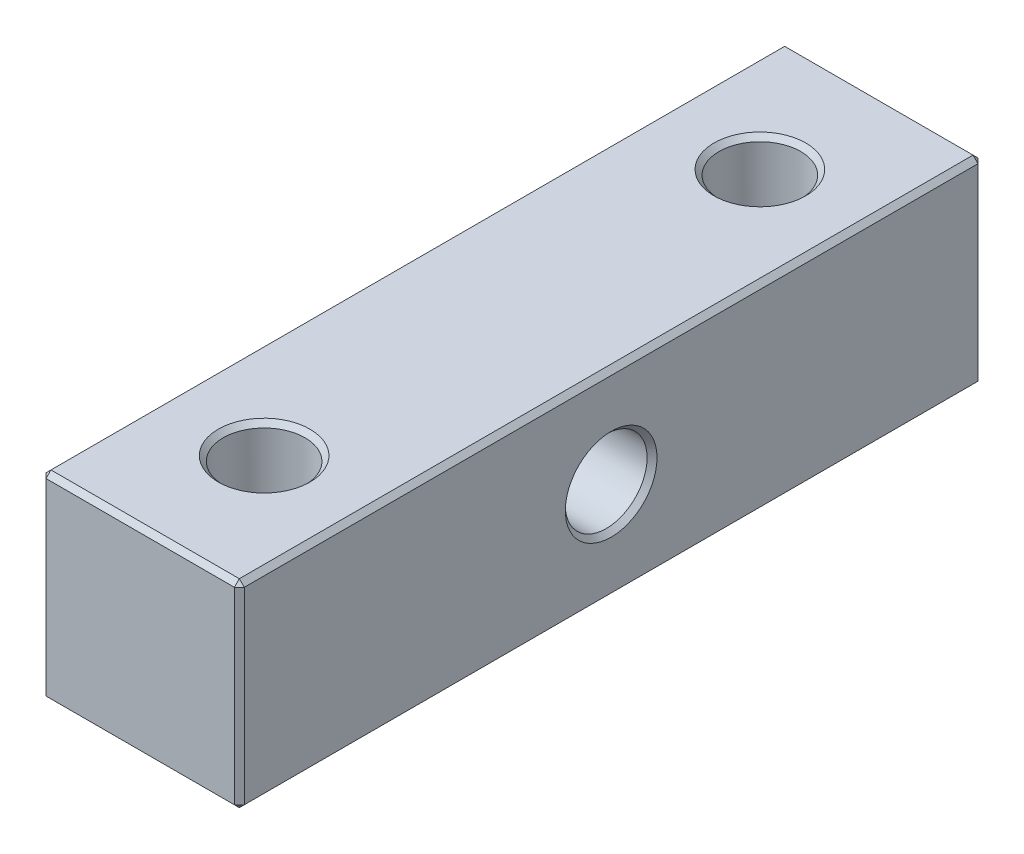
ISO-10303-21;
HEADER;
FILE_DESCRIPTION(('STEP AP214'),'2;1');
FILE_NAME('part.step','',(''),(''),'','','');
FILE_SCHEMA(('AUTOMOTIVE_DESIGN { 1 0 10303 214 1 1 1 1 }'));
ENDSEC;
DATA;
#1=APPLICATION_CONTEXT('core data for automotive mechanical design processes');
#2=APPLICATION_PROTOCOL_DEFINITION('international standard','automotive_design',2000,#1);
#3=PRODUCT_CONTEXT('',#1,'mechanical');
#4=PRODUCT('Part','Part','',(#3));
#5=PRODUCT_RELATED_PRODUCT_CATEGORY('part','',(#4));
#6=PRODUCT_DEFINITION_FORMATION('','',#4);
#7=PRODUCT_DEFINITION_CONTEXT('part definition',#1,'design');
#8=PRODUCT_DEFINITION('design','',#6,#7);
#9=PRODUCT_DEFINITION_SHAPE('','',#8);
#10=(LENGTH_UNIT() NAMED_UNIT(*) SI_UNIT(.MILLI.,.METRE.));
#11=(NAMED_UNIT(*) PLANE_ANGLE_UNIT() SI_UNIT($,.RADIAN.));
#12=(NAMED_UNIT(*) SI_UNIT($,.STERADIAN.) SOLID_ANGLE_UNIT());
#13=UNCERTAINTY_MEASURE_WITH_UNIT(LENGTH_MEASURE(1.E-05),#10,'distance_accuracy_value','');
#14=(GEOMETRIC_REPRESENTATION_CONTEXT(3) GLOBAL_UNCERTAINTY_ASSIGNED_CONTEXT((#13)) GLOBAL_UNIT_ASSIGNED_CONTEXT((#10,
#11,#12)) REPRESENTATION_CONTEXT('',''));
#15=CARTESIAN_POINT('',(0.,0.,0.));
#16=DIRECTION('',(0.,0.,1.));
#17=DIRECTION('',(1.,0.,0.));
#18=AXIS2_PLACEMENT_3D('',#15,#16,#17);
#19=CARTESIAN_POINT('',(4.,4.,15.));
#20=DIRECTION('',(-1.,0.,0.));
#21=DIRECTION('',(0.,-1.,0.));
#22=AXIS2_PLACEMENT_3D('',#19,#20,#21);
#23=PLANE('',#22);
#24=DIRECTION('',(0.,-1.,0.));
#25=VECTOR('',#24,1.);
#26=CARTESIAN_POINT('',(4.,-4.,14.8));
#27=LINE('',#26,#25);
#28=CARTESIAN_POINT('',(4.,3.8,14.8));
#29=VERTEX_POINT('',#28);
#30=CARTESIAN_POINT('',(4.,-3.8,14.8));
#31=VERTEX_POINT('',#30);
#32=EDGE_CURVE('E51',#29,#31,#27,.T.);
#33=ORIENTED_EDGE('',*,*,#32,.T.);
#34=DIRECTION('',(0.,0.,-1.));
#35=VECTOR('',#34,1.);
#36=CARTESIAN_POINT('',(4.,-3.8,15.));
#37=LINE('',#36,#35);
#38=CARTESIAN_POINT('',(4.,-3.8,-14.8));
#39=VERTEX_POINT('',#38);
#40=EDGE_CURVE('E11',#31,#39,#37,.T.);
#41=ORIENTED_EDGE('',*,*,#40,.T.);
#42=DIRECTION('',(0.,1.,0.));
#43=VECTOR('',#42,1.);
#44=CARTESIAN_POINT('',(4.,4.,-14.8));
#45=LINE('',#44,#43);
#46=CARTESIAN_POINT('',(4.,3.8,-14.8));
#47=VERTEX_POINT('',#46);
#48=EDGE_CURVE('E244',#39,#47,#45,.T.);
#49=ORIENTED_EDGE('',*,*,#48,.T.);
#50=DIRECTION('',(0.,0.,1.));
#51=VECTOR('',#50,1.);
#52=CARTESIAN_POINT('',(4.,3.8,15.));
#53=LINE('',#52,#51);
#54=EDGE_CURVE('E62',#47,#29,#53,.T.);
#55=ORIENTED_EDGE('',*,*,#54,.T.);
#56=EDGE_LOOP('',(#33,#41,#49,#55));
#57=FACE_BOUND('',#56,.T.);
#58=CARTESIAN_POINT('',(4.,0.,0.));
#59=DIRECTION('',(-1.,0.,0.));
#60=DIRECTION('',(0.,-1.,0.));
#61=AXIS2_PLACEMENT_3D('',#58,#59,#60);
#62=CIRCLE('',#61,1.84999999999999);
#63=CARTESIAN_POINT('',(4.,-1.84999999999999,0.));
#64=VERTEX_POINT('',#63);
#65=EDGE_CURVE('E241',#64,#64,#62,.T.);
#66=ORIENTED_EDGE('',*,*,#65,.T.);
#67=EDGE_LOOP('',(#66));
#68=FACE_BOUND('',#67,.T.);
#69=ADVANCED_FACE('F41',(#57,#68),#23,.F.);
#70=CARTESIAN_POINT('',(-4.,4.,15.));
#71=DIRECTION('',(0.,-1.,0.));
#72=DIRECTION('',(0.,0.,-1.));
#73=AXIS2_PLACEMENT_3D('',#70,#71,#72);
#74=PLANE('',#73);
#75=CARTESIAN_POINT('',(0.,4.,-10.));
#76=DIRECTION('',(0.,-1.,0.));
#77=DIRECTION('',(0.,0.,-1.));
#78=AXIS2_PLACEMENT_3D('',#75,#76,#77);
#79=CIRCLE('',#78,1.84999999999999);
#80=CARTESIAN_POINT('',(0.,4.,-11.85));
#81=VERTEX_POINT('',#80);
#82=EDGE_CURVE('E222',#81,#81,#79,.T.);
#83=ORIENTED_EDGE('',*,*,#82,.T.);
#84=EDGE_LOOP('',(#83));
#85=FACE_BOUND('',#84,.T.);
#86=CARTESIAN_POINT('',(0.,4.,10.));
#87=DIRECTION('',(0.,-1.,0.));
#88=DIRECTION('',(0.,0.,-1.));
#89=AXIS2_PLACEMENT_3D('',#86,#87,#88);
#90=CIRCLE('',#89,1.84999999999999);
#91=CARTESIAN_POINT('',(0.,4.,8.15000000000001));
#92=VERTEX_POINT('',#91);
#93=EDGE_CURVE('E219',#92,#92,#90,.T.);
#94=ORIENTED_EDGE('',*,*,#93,.T.);
#95=EDGE_LOOP('',(#94));
#96=FACE_BOUND('',#95,.T.);
#97=DIRECTION('',(0.,0.,1.));
#98=VECTOR('',#97,1.);
#99=CARTESIAN_POINT('',(-3.8,4.,15.));
#100=LINE('',#99,#98);
#101=CARTESIAN_POINT('',(-3.8,4.,-14.8));
#102=VERTEX_POINT('',#101);
#103=CARTESIAN_POINT('',(-3.8,4.,14.8));
#104=VERTEX_POINT('',#103);
#105=EDGE_CURVE('E214',#102,#104,#100,.T.);
#106=ORIENTED_EDGE('',*,*,#105,.T.);
#107=DIRECTION('',(1.,0.,0.));
#108=VECTOR('',#107,1.);
#109=CARTESIAN_POINT('',(4.,4.,14.8));
#110=LINE('',#109,#108);
#111=CARTESIAN_POINT('',(3.8,4.,14.8));
#112=VERTEX_POINT('',#111);
#113=EDGE_CURVE('E216',#104,#112,#110,.T.);
#114=ORIENTED_EDGE('',*,*,#113,.T.);
#115=DIRECTION('',(0.,0.,-1.));
#116=VECTOR('',#115,1.);
#117=CARTESIAN_POINT('',(3.8,4.,15.));
#118=LINE('',#117,#116);
#119=CARTESIAN_POINT('',(3.8,4.,-14.8));
#120=VERTEX_POINT('',#119);
#121=EDGE_CURVE('E210',#112,#120,#118,.T.);
#122=ORIENTED_EDGE('',*,*,#121,.T.);
#123=DIRECTION('',(-1.,0.,0.));
#124=VECTOR('',#123,1.);
#125=CARTESIAN_POINT('',(-4.,4.,-14.8));
#126=LINE('',#125,#124);
#127=EDGE_CURVE('E212',#120,#102,#126,.T.);
#128=ORIENTED_EDGE('',*,*,#127,.T.);
#129=EDGE_LOOP('',(#106,#114,#122,#128));
#130=FACE_BOUND('',#129,.T.);
#131=ADVANCED_FACE('F344',(#85,#96,#130),#74,.F.);
#132=CARTESIAN_POINT('',(-4.,4.,15.));
#133=DIRECTION('',(1.,0.,0.));
#134=DIRECTION('',(0.,1.,0.));
#135=AXIS2_PLACEMENT_3D('',#132,#133,#134);
#136=PLANE('',#135);
#137=CARTESIAN_POINT('',(-4.,0.,0.));
#138=DIRECTION('',(1.,0.,0.));
#139=DIRECTION('',(0.,1.,0.));
#140=AXIS2_PLACEMENT_3D('',#137,#138,#139);
#141=CIRCLE('',#140,1.84999999999999);
#142=CARTESIAN_POINT('',(-4.,1.84999999999999,0.));
#143=VERTEX_POINT('',#142);
#144=EDGE_CURVE('E201',#143,#143,#141,.T.);
#145=ORIENTED_EDGE('',*,*,#144,.T.);
#146=EDGE_LOOP('',(#145));
#147=FACE_BOUND('',#146,.T.);
#148=DIRECTION('',(0.,0.,1.));
#149=VECTOR('',#148,1.);
#150=CARTESIAN_POINT('',(-4.,-3.8,15.));
#151=LINE('',#150,#149);
#152=CARTESIAN_POINT('',(-4.,-3.8,-14.8));
#153=VERTEX_POINT('',#152);
#154=CARTESIAN_POINT('',(-4.,-3.8,14.8));
#155=VERTEX_POINT('',#154);
#156=EDGE_CURVE('E196',#153,#155,#151,.T.);
#157=ORIENTED_EDGE('',*,*,#156,.T.);
#158=DIRECTION('',(0.,1.,0.));
#159=VECTOR('',#158,1.);
#160=CARTESIAN_POINT('',(-4.,4.,14.8));
#161=LINE('',#160,#159);
#162=CARTESIAN_POINT('',(-4.,3.8,14.8));
#163=VERTEX_POINT('',#162);
#164=EDGE_CURVE('E198',#155,#163,#161,.T.);
#165=ORIENTED_EDGE('',*,*,#164,.T.);
#166=DIRECTION('',(0.,0.,-1.));
#167=VECTOR('',#166,1.);
#168=CARTESIAN_POINT('',(-4.,3.8,15.));
#169=LINE('',#168,#167);
#170=CARTESIAN_POINT('',(-4.,3.8,-14.8));
#171=VERTEX_POINT('',#170);
#172=EDGE_CURVE('E192',#163,#171,#169,.T.);
#173=ORIENTED_EDGE('',*,*,#172,.T.);
#174=DIRECTION('',(0.,-1.,0.));
#175=VECTOR('',#174,1.);
#176=CARTESIAN_POINT('',(-4.,4.,-14.8));
#177=LINE('',#176,#175);
#178=EDGE_CURVE('E194',#171,#153,#177,.T.);
#179=ORIENTED_EDGE('',*,*,#178,.T.);
#180=EDGE_LOOP('',(#157,#165,#173,#179));
#181=FACE_BOUND('',#180,.T.);
#182=ADVANCED_FACE('F373',(#147,#181),#136,.F.);
#183=CARTESIAN_POINT('',(-4.,-4.,15.));
#184=DIRECTION('',(0.,1.,0.));
#185=DIRECTION('',(0.,0.,1.));
#186=AXIS2_PLACEMENT_3D('',#183,#184,#185);
#187=PLANE('',#186);
#188=CARTESIAN_POINT('',(0.,-4.,-10.));
#189=DIRECTION('',(0.,1.,0.));
#190=DIRECTION('',(0.,0.,1.));
#191=AXIS2_PLACEMENT_3D('',#188,#189,#190);
#192=CIRCLE('',#191,1.85);
#193=CARTESIAN_POINT('',(0.,-4.,-8.15));
#194=VERTEX_POINT('',#193);
#195=EDGE_CURVE('E177',#194,#194,#192,.T.);
#196=ORIENTED_EDGE('',*,*,#195,.T.);
#197=EDGE_LOOP('',(#196));
#198=FACE_BOUND('',#197,.T.);
#199=CARTESIAN_POINT('',(0.,-4.,10.));
#200=DIRECTION('',(0.,1.,0.));
#201=DIRECTION('',(0.,0.,1.));
#202=AXIS2_PLACEMENT_3D('',#199,#200,#201);
#203=CIRCLE('',#202,1.85);
#204=CARTESIAN_POINT('',(0.,-4.,11.85));
#205=VERTEX_POINT('',#204);
#206=EDGE_CURVE('E174',#205,#205,#203,.T.);
#207=ORIENTED_EDGE('',*,*,#206,.T.);
#208=EDGE_LOOP('',(#207));
#209=FACE_BOUND('',#208,.T.);
#210=DIRECTION('',(-1.,0.,0.));
#211=VECTOR('',#210,1.);
#212=CARTESIAN_POINT('',(-4.,-4.,14.8));
#213=LINE('',#212,#211);
#214=CARTESIAN_POINT('',(3.8,-4.,14.8));
#215=VERTEX_POINT('',#214);
#216=CARTESIAN_POINT('',(-3.8,-4.,14.8));
#217=VERTEX_POINT('',#216);
#218=EDGE_CURVE('E142',#215,#217,#213,.T.);
#219=ORIENTED_EDGE('',*,*,#218,.T.);
#220=DIRECTION('',(0.,0.,-1.));
#221=VECTOR('',#220,1.);
#222=CARTESIAN_POINT('',(-3.8,-4.,15.));
#223=LINE('',#222,#221);
#224=CARTESIAN_POINT('',(-3.8,-4.,-14.8));
#225=VERTEX_POINT('',#224);
#226=EDGE_CURVE('E138',#217,#225,#223,.T.);
#227=ORIENTED_EDGE('',*,*,#226,.T.);
#228=DIRECTION('',(1.,0.,0.));
#229=VECTOR('',#228,1.);
#230=CARTESIAN_POINT('',(-4.,-4.,-14.8));
#231=LINE('',#230,#229);
#232=CARTESIAN_POINT('',(3.8,-4.,-14.8));
#233=VERTEX_POINT('',#232);
#234=EDGE_CURVE('E130',#225,#233,#231,.T.);
#235=ORIENTED_EDGE('',*,*,#234,.T.);
#236=DIRECTION('',(0.,0.,1.));
#237=VECTOR('',#236,1.);
#238=CARTESIAN_POINT('',(3.8,-4.,15.));
#239=LINE('',#238,#237);
#240=EDGE_CURVE('E135',#233,#215,#239,.T.);
#241=ORIENTED_EDGE('',*,*,#240,.T.);
#242=EDGE_LOOP('',(#219,#227,#235,#241));
#243=FACE_BOUND('',#242,.T.);
#244=ADVANCED_FACE('F133',(#198,#209,#243),#187,.F.);
#245=CARTESIAN_POINT('',(0.,0.,15.));
#246=DIRECTION('',(0.,0.,1.));
#247=DIRECTION('',(1.,0.,0.));
#248=AXIS2_PLACEMENT_3D('',#245,#246,#247);
#249=PLANE('',#248);
#250=DIRECTION('',(0.,-1.,0.));
#251=VECTOR('',#250,1.);
#252=CARTESIAN_POINT('',(-3.8,-4.,15.));
#253=LINE('',#252,#251);
#254=CARTESIAN_POINT('',(-3.8,3.8,15.));
#255=VERTEX_POINT('',#254);
#256=CARTESIAN_POINT('',(-3.8,-3.8,15.));
#257=VERTEX_POINT('',#256);
#258=EDGE_CURVE('E229',#255,#257,#253,.T.);
#259=ORIENTED_EDGE('',*,*,#258,.T.);
#260=DIRECTION('',(1.,0.,0.));
#261=VECTOR('',#260,1.);
#262=CARTESIAN_POINT('',(4.,-3.8,15.));
#263=LINE('',#262,#261);
#264=CARTESIAN_POINT('',(3.8,-3.8,15.));
#265=VERTEX_POINT('',#264);
#266=EDGE_CURVE('E231',#257,#265,#263,.T.);
#267=ORIENTED_EDGE('',*,*,#266,.T.);
#268=DIRECTION('',(0.,1.,0.));
#269=VECTOR('',#268,1.);
#270=CARTESIAN_POINT('',(3.8,4.,15.));
#271=LINE('',#270,#269);
#272=CARTESIAN_POINT('',(3.8,3.8,15.));
#273=VERTEX_POINT('',#272);
#274=EDGE_CURVE('E225',#265,#273,#271,.T.);
#275=ORIENTED_EDGE('',*,*,#274,.T.);
#276=DIRECTION('',(-1.,0.,0.));
#277=VECTOR('',#276,1.);
#278=CARTESIAN_POINT('',(-4.,3.8,15.));
#279=LINE('',#278,#277);
#280=EDGE_CURVE('E227',#273,#255,#279,.T.);
#281=ORIENTED_EDGE('',*,*,#280,.T.);
#282=EDGE_LOOP('',(#259,#267,#275,#281));
#283=FACE_BOUND('',#282,.T.);
#284=ADVANCED_FACE('F364',(#283),#249,.T.);
#285=CARTESIAN_POINT('',(0.,0.,-15.));
#286=DIRECTION('',(0.,0.,1.));
#287=DIRECTION('',(1.,0.,0.));
#288=AXIS2_PLACEMENT_3D('',#285,#286,#287);
#289=PLANE('',#288);
#290=DIRECTION('',(0.,-1.,0.));
#291=VECTOR('',#290,1.);
#292=CARTESIAN_POINT('',(3.8,0.,-15.));
#293=LINE('',#292,#291);
#294=CARTESIAN_POINT('',(3.8,3.8,-15.));
#295=VERTEX_POINT('',#294);
#296=CARTESIAN_POINT('',(3.8,-3.8,-15.));
#297=VERTEX_POINT('',#296);
#298=EDGE_CURVE('E234',#295,#297,#293,.T.);
#299=ORIENTED_EDGE('',*,*,#298,.T.);
#300=DIRECTION('',(-1.,0.,0.));
#301=VECTOR('',#300,1.);
#302=CARTESIAN_POINT('',(0.,-3.8,-15.));
#303=LINE('',#302,#301);
#304=CARTESIAN_POINT('',(-3.8,-3.8,-15.));
#305=VERTEX_POINT('',#304);
#306=EDGE_CURVE('E150',#297,#305,#303,.T.);
#307=ORIENTED_EDGE('',*,*,#306,.T.);
#308=DIRECTION('',(0.,1.,0.));
#309=VECTOR('',#308,1.);
#310=CARTESIAN_POINT('',(-3.8,0.,-15.));
#311=LINE('',#310,#309);
#312=CARTESIAN_POINT('',(-3.8,3.8,-15.));
#313=VERTEX_POINT('',#312);
#314=EDGE_CURVE('E238',#305,#313,#311,.T.);
#315=ORIENTED_EDGE('',*,*,#314,.T.);
#316=DIRECTION('',(1.,0.,0.));
#317=VECTOR('',#316,1.);
#318=CARTESIAN_POINT('',(0.,3.8,-15.));
#319=LINE('',#318,#317);
#320=EDGE_CURVE('E236',#313,#295,#319,.T.);
#321=ORIENTED_EDGE('',*,*,#320,.T.);
#322=EDGE_LOOP('',(#299,#307,#315,#321));
#323=FACE_BOUND('',#322,.T.);
#324=ADVANCED_FACE('F339',(#323),#289,.F.);
#325=CARTESIAN_POINT('',(4.,0.,0.));
#326=DIRECTION('',(1.,0.,0.));
#327=DIRECTION('',(0.,0.,-1.));
#328=AXIS2_PLACEMENT_3D('',#325,#326,#327);
#329=CYLINDRICAL_SURFACE('',#328,1.65);
#330=CARTESIAN_POINT('',(-3.8,0.,0.));
#331=DIRECTION('',(1.,0.,0.));
#332=DIRECTION('',(0.,0.,-1.));
#333=AXIS2_PLACEMENT_3D('',#330,#331,#332);
#334=CIRCLE('',#333,1.65);
#335=CARTESIAN_POINT('',(-3.8,0.,-1.65));
#336=VERTEX_POINT('',#335);
#337=EDGE_CURVE('E207',#336,#336,#334,.F.);
#338=ORIENTED_EDGE('',*,*,#337,.T.);
#339=EDGE_LOOP('',(#338));
#340=FACE_BOUND('',#339,.T.);
#341=CARTESIAN_POINT('',(3.80000000000001,0.,0.));
#342=DIRECTION('',(-1.,0.,0.));
#343=DIRECTION('',(0.,0.,1.));
#344=AXIS2_PLACEMENT_3D('',#341,#342,#343);
#345=CIRCLE('',#344,1.65);
#346=CARTESIAN_POINT('',(3.80000000000001,0.,1.65));
#347=VERTEX_POINT('',#346);
#348=EDGE_CURVE('E204',#347,#347,#345,.F.);
#349=ORIENTED_EDGE('',*,*,#348,.T.);
#350=EDGE_LOOP('',(#349));
#351=FACE_BOUND('',#350,.T.);
#352=ADVANCED_FACE('F352',(#340,#351),#329,.F.);
#353=CARTESIAN_POINT('',(0.,4.,-10.));
#354=DIRECTION('',(0.,1.,0.));
#355=DIRECTION('',(0.,0.,1.));
#356=AXIS2_PLACEMENT_3D('',#353,#354,#355);
#357=CYLINDRICAL_SURFACE('',#356,1.65);
#358=CARTESIAN_POINT('',(0.,-3.8,-10.));
#359=DIRECTION('',(0.,1.,0.));
#360=DIRECTION('',(0.,0.,1.));
#361=AXIS2_PLACEMENT_3D('',#358,#359,#360);
#362=CIRCLE('',#361,1.65);
#363=CARTESIAN_POINT('',(0.,-3.8,-8.35));
#364=VERTEX_POINT('',#363);
#365=EDGE_CURVE('E183',#364,#364,#362,.F.);
#366=ORIENTED_EDGE('',*,*,#365,.T.);
#367=EDGE_LOOP('',(#366));
#368=FACE_BOUND('',#367,.T.);
#369=CARTESIAN_POINT('',(0.,3.8,-10.));
#370=DIRECTION('',(0.,-1.,0.));
#371=DIRECTION('',(0.,0.,-1.));
#372=AXIS2_PLACEMENT_3D('',#369,#370,#371);
#373=CIRCLE('',#372,1.65);
#374=CARTESIAN_POINT('',(0.,3.8,-11.65));
#375=VERTEX_POINT('',#374);
#376=EDGE_CURVE('E180',#375,#375,#373,.F.);
#377=ORIENTED_EDGE('',*,*,#376,.T.);
#378=EDGE_LOOP('',(#377));
#379=FACE_BOUND('',#378,.T.);
#380=ADVANCED_FACE('F354',(#368,#379),#357,.F.);
#381=CARTESIAN_POINT('',(0.,4.,10.));
#382=DIRECTION('',(0.,1.,0.));
#383=DIRECTION('',(0.,0.,1.));
#384=AXIS2_PLACEMENT_3D('',#381,#382,#383);
#385=CYLINDRICAL_SURFACE('',#384,1.65);
#386=CARTESIAN_POINT('',(0.,-3.8,10.));
#387=DIRECTION('',(0.,1.,0.));
#388=DIRECTION('',(0.,0.,1.));
#389=AXIS2_PLACEMENT_3D('',#386,#387,#388);
#390=CIRCLE('',#389,1.65);
#391=CARTESIAN_POINT('',(0.,-3.8,11.65));
#392=VERTEX_POINT('',#391);
#393=EDGE_CURVE('E189',#392,#392,#390,.F.);
#394=ORIENTED_EDGE('',*,*,#393,.T.);
#395=EDGE_LOOP('',(#394));
#396=FACE_BOUND('',#395,.T.);
#397=CARTESIAN_POINT('',(0.,3.8,10.));
#398=DIRECTION('',(0.,-1.,0.));
#399=DIRECTION('',(0.,0.,-1.));
#400=AXIS2_PLACEMENT_3D('',#397,#398,#399);
#401=CIRCLE('',#400,1.65);
#402=CARTESIAN_POINT('',(0.,3.8,8.35));
#403=VERTEX_POINT('',#402);
#404=EDGE_CURVE('E186',#403,#403,#401,.F.);
#405=ORIENTED_EDGE('',*,*,#404,.T.);
#406=EDGE_LOOP('',(#405));
#407=FACE_BOUND('',#406,.T.);
#408=ADVANCED_FACE('F361',(#396,#407),#385,.F.);
#409=CARTESIAN_POINT('',(0.,-4.,-10.));
#410=DIRECTION('',(0.,-1.,0.));
#411=DIRECTION('',(0.,0.,-1.));
#412=AXIS2_PLACEMENT_3D('',#409,#410,#411);
#413=CONICAL_SURFACE('',#412,1.85,0.785398163397444);
#414=ORIENTED_EDGE('',*,*,#365,.F.);
#415=EDGE_LOOP('',(#414));
#416=FACE_BOUND('',#415,.T.);
#417=ORIENTED_EDGE('',*,*,#195,.F.);
#418=EDGE_LOOP('',(#417));
#419=FACE_BOUND('',#418,.T.);
#420=ADVANCED_FACE('F382',(#416,#419),#413,.F.);
#421=CARTESIAN_POINT('',(0.,-4.,10.));
#422=DIRECTION('',(0.,-1.,0.));
#423=DIRECTION('',(0.,0.,-1.));
#424=AXIS2_PLACEMENT_3D('',#421,#422,#423);
#425=CONICAL_SURFACE('',#424,1.85,0.785398163397444);
#426=ORIENTED_EDGE('',*,*,#393,.F.);
#427=EDGE_LOOP('',(#426));
#428=FACE_BOUND('',#427,.T.);
#429=ORIENTED_EDGE('',*,*,#206,.F.);
#430=EDGE_LOOP('',(#429));
#431=FACE_BOUND('',#430,.T.);
#432=ADVANCED_FACE('F388',(#428,#431),#425,.F.);
#433=CARTESIAN_POINT('',(-4.,0.,0.));
#434=DIRECTION('',(-1.,0.,0.));
#435=DIRECTION('',(0.,0.,1.));
#436=AXIS2_PLACEMENT_3D('',#433,#434,#435);
#437=CONICAL_SURFACE('',#436,1.84999999999999,0.785398163397435);
#438=ORIENTED_EDGE('',*,*,#337,.F.);
#439=EDGE_LOOP('',(#438));
#440=FACE_BOUND('',#439,.T.);
#441=ORIENTED_EDGE('',*,*,#144,.F.);
#442=EDGE_LOOP('',(#441));
#443=FACE_BOUND('',#442,.T.);
#444=ADVANCED_FACE('F395',(#440,#443),#437,.F.);
#445=CARTESIAN_POINT('',(0.,3.8,-10.));
#446=DIRECTION('',(0.,1.,0.));
#447=DIRECTION('',(0.,0.,1.));
#448=AXIS2_PLACEMENT_3D('',#445,#446,#447);
#449=CONICAL_SURFACE('',#448,1.65,0.785398163397444);
#450=ORIENTED_EDGE('',*,*,#82,.F.);
#451=EDGE_LOOP('',(#450));
#452=FACE_BOUND('',#451,.T.);
#453=ORIENTED_EDGE('',*,*,#376,.F.);
#454=EDGE_LOOP('',(#453));
#455=FACE_BOUND('',#454,.T.);
#456=ADVANCED_FACE('F402',(#452,#455),#449,.F.);
#457=CARTESIAN_POINT('',(0.,3.8,10.));
#458=DIRECTION('',(0.,1.,0.));
#459=DIRECTION('',(0.,0.,1.));
#460=AXIS2_PLACEMENT_3D('',#457,#458,#459);
#461=CONICAL_SURFACE('',#460,1.65,0.785398163397444);
#462=ORIENTED_EDGE('',*,*,#93,.F.);
#463=EDGE_LOOP('',(#462));
#464=FACE_BOUND('',#463,.T.);
#465=ORIENTED_EDGE('',*,*,#404,.F.);
#466=EDGE_LOOP('',(#465));
#467=FACE_BOUND('',#466,.T.);
#468=ADVANCED_FACE('F409',(#464,#467),#461,.F.);
#469=CARTESIAN_POINT('',(-4.,4.,-14.8));
#470=DIRECTION('',(0.,-0.707106781186548,0.707106781186548));
#471=DIRECTION('',(-1.,0.,0.));
#472=AXIS2_PLACEMENT_3D('',#469,#470,#471);
#473=PLANE('',#472);
#474=DIRECTION('',(0.,0.707106781186547,0.707106781186547));
#475=VECTOR('',#474,1.);
#476=CARTESIAN_POINT('',(-3.8,3.8,-15.));
#477=LINE('',#476,#475);
#478=EDGE_CURVE('E46',#102,#313,#477,.F.);
#479=ORIENTED_EDGE('',*,*,#478,.F.);
#480=ORIENTED_EDGE('',*,*,#127,.F.);
#481=DIRECTION('',(0.,-0.707106781186547,-0.707106781186547));
#482=VECTOR('',#481,1.);
#483=CARTESIAN_POINT('',(3.8,3.8,-15.));
#484=LINE('',#483,#482);
#485=EDGE_CURVE('E170',#295,#120,#484,.F.);
#486=ORIENTED_EDGE('',*,*,#485,.F.);
#487=ORIENTED_EDGE('',*,*,#320,.F.);
#488=EDGE_LOOP('',(#479,#480,#486,#487));
#489=FACE_BOUND('',#488,.T.);
#490=ADVANCED_FACE('F416',(#489),#473,.F.);
#491=CARTESIAN_POINT('',(-3.8,3.8,-15.));
#492=DIRECTION('',(-0.577350269189626,0.577350269189626,-0.577350269189626));
#493=DIRECTION('',(-0.707106781186548,0.,0.707106781186548));
#494=AXIS2_PLACEMENT_3D('',#491,#492,#493);
#495=PLANE('',#494);
#496=DIRECTION('',(-0.707106781186547,-0.707106781186547,0.));
#497=VECTOR('',#496,1.);
#498=CARTESIAN_POINT('',(-3.9,3.9,-14.8));
#499=LINE('',#498,#497);
#500=EDGE_CURVE('E289',#102,#171,#499,.T.);
#501=ORIENTED_EDGE('',*,*,#500,.F.);
#502=ORIENTED_EDGE('',*,*,#478,.T.);
#503=DIRECTION('',(0.707106781186547,0.,-0.707106781186547));
#504=VECTOR('',#503,1.);
#505=CARTESIAN_POINT('',(-3.8,3.8,-15.));
#506=LINE('',#505,#504);
#507=EDGE_CURVE('E292',#171,#313,#506,.T.);
#508=ORIENTED_EDGE('',*,*,#507,.F.);
#509=EDGE_LOOP('',(#501,#502,#508));
#510=FACE_BOUND('',#509,.T.);
#511=ADVANCED_FACE('F517',(#510),#495,.T.);
#512=CARTESIAN_POINT('',(3.8,3.8,-15.));
#513=DIRECTION('',(0.577350269189626,0.577350269189626,-0.577350269189626));
#514=DIRECTION('',(-0.707106781186548,0.,-0.707106781186548));
#515=AXIS2_PLACEMENT_3D('',#512,#513,#514);
#516=PLANE('',#515);
#517=DIRECTION('',(0.707106781186548,0.,0.707106781186548));
#518=VECTOR('',#517,1.);
#519=CARTESIAN_POINT('',(3.8,3.8,-15.));
#520=LINE('',#519,#518);
#521=EDGE_CURVE('E283',#295,#47,#520,.T.);
#522=ORIENTED_EDGE('',*,*,#521,.F.);
#523=ORIENTED_EDGE('',*,*,#485,.T.);
#524=DIRECTION('',(-0.707106781186547,0.707106781186547,0.));
#525=VECTOR('',#524,1.);
#526=CARTESIAN_POINT('',(3.9,3.9,-14.8));
#527=LINE('',#526,#525);
#528=EDGE_CURVE('E286',#47,#120,#527,.T.);
#529=ORIENTED_EDGE('',*,*,#528,.F.);
#530=EDGE_LOOP('',(#522,#523,#529));
#531=FACE_BOUND('',#530,.T.);
#532=ADVANCED_FACE('F299',(#531),#516,.T.);
#533=CARTESIAN_POINT('',(-4.,4.,-14.8));
#534=DIRECTION('',(0.707106781186548,0.,0.707106781186548));
#535=DIRECTION('',(0.,-1.,0.));
#536=AXIS2_PLACEMENT_3D('',#533,#534,#535);
#537=PLANE('',#536);
#538=ORIENTED_EDGE('',*,*,#507,.T.);
#539=ORIENTED_EDGE('',*,*,#314,.F.);
#540=DIRECTION('',(-0.707106781186548,0.,0.707106781186548));
#541=VECTOR('',#540,1.);
#542=CARTESIAN_POINT('',(-3.8,-3.8,-15.));
#543=LINE('',#542,#541);
#544=EDGE_CURVE('E279',#153,#305,#543,.F.);
#545=ORIENTED_EDGE('',*,*,#544,.F.);
#546=ORIENTED_EDGE('',*,*,#178,.F.);
#547=EDGE_LOOP('',(#538,#539,#545,#546));
#548=FACE_BOUND('',#547,.T.);
#549=ADVANCED_FACE('F335',(#548),#537,.F.);
#550=CARTESIAN_POINT('',(-4.,3.8,15.));
#551=DIRECTION('',(0.707106781186548,-0.707106781186548,0.));
#552=DIRECTION('',(0.,0.,-1.));
#553=AXIS2_PLACEMENT_3D('',#550,#551,#552);
#554=PLANE('',#553);
#555=ORIENTED_EDGE('',*,*,#500,.T.);
#556=ORIENTED_EDGE('',*,*,#172,.F.);
#557=DIRECTION('',(0.707106781186547,0.707106781186547,0.));
#558=VECTOR('',#557,1.);
#559=CARTESIAN_POINT('',(-4.,3.8,14.8));
#560=LINE('',#559,#558);
#561=EDGE_CURVE('E276',#104,#163,#560,.F.);
#562=ORIENTED_EDGE('',*,*,#561,.F.);
#563=ORIENTED_EDGE('',*,*,#105,.F.);
#564=EDGE_LOOP('',(#555,#556,#562,#563));
#565=FACE_BOUND('',#564,.T.);
#566=ADVANCED_FACE('F499',(#565),#554,.F.);
#567=CARTESIAN_POINT('',(0.,3.8,15.));
#568=DIRECTION('',(0.,0.707106781186548,0.707106781186548));
#569=DIRECTION('',(1.,0.,0.));
#570=AXIS2_PLACEMENT_3D('',#567,#568,#569);
#571=PLANE('',#570);
#572=DIRECTION('',(0.,-0.707106781186547,0.707106781186547));
#573=VECTOR('',#572,1.);
#574=CARTESIAN_POINT('',(3.8,4.,14.8));
#575=LINE('',#574,#573);
#576=EDGE_CURVE('E270',#112,#273,#575,.T.);
#577=ORIENTED_EDGE('',*,*,#576,.F.);
#578=ORIENTED_EDGE('',*,*,#113,.F.);
#579=DIRECTION('',(0.,0.707106781186547,-0.707106781186547));
#580=VECTOR('',#579,1.);
#581=CARTESIAN_POINT('',(-3.8,3.9,14.9));
#582=LINE('',#581,#580);
#583=EDGE_CURVE('E273',#255,#104,#582,.T.);
#584=ORIENTED_EDGE('',*,*,#583,.F.);
#585=ORIENTED_EDGE('',*,*,#280,.F.);
#586=EDGE_LOOP('',(#577,#578,#584,#585));
#587=FACE_BOUND('',#586,.T.);
#588=ADVANCED_FACE('F493',(#587),#571,.T.);
#589=CARTESIAN_POINT('',(3.8,4.,15.));
#590=DIRECTION('',(-0.707106781186548,-0.707106781186548,0.));
#591=DIRECTION('',(0.,0.,-1.));
#592=AXIS2_PLACEMENT_3D('',#589,#590,#591);
#593=PLANE('',#592);
#594=ORIENTED_EDGE('',*,*,#528,.T.);
#595=ORIENTED_EDGE('',*,*,#121,.F.);
#596=DIRECTION('',(0.707106781186547,-0.707106781186547,0.));
#597=VECTOR('',#596,1.);
#598=CARTESIAN_POINT('',(3.8,4.,14.8));
#599=LINE('',#598,#597);
#600=EDGE_CURVE('E268',#29,#112,#599,.F.);
#601=ORIENTED_EDGE('',*,*,#600,.F.);
#602=ORIENTED_EDGE('',*,*,#54,.F.);
#603=EDGE_LOOP('',(#594,#595,#601,#602));
#604=FACE_BOUND('',#603,.T.);
#605=ADVANCED_FACE('F306',(#604),#593,.F.);
#606=CARTESIAN_POINT('',(4.,4.,-14.8));
#607=DIRECTION('',(-0.707106781186548,0.,0.707106781186548));
#608=DIRECTION('',(0.,1.,0.));
#609=AXIS2_PLACEMENT_3D('',#606,#607,#608);
#610=PLANE('',#609);
#611=ORIENTED_EDGE('',*,*,#521,.T.);
#612=ORIENTED_EDGE('',*,*,#48,.F.);
#613=DIRECTION('',(-0.707106781186547,0.,-0.707106781186547));
#614=VECTOR('',#613,1.);
#615=CARTESIAN_POINT('',(3.9,-3.8,-14.9));
#616=LINE('',#615,#614);
#617=EDGE_CURVE('E154',#297,#39,#616,.F.);
#618=ORIENTED_EDGE('',*,*,#617,.F.);
#619=ORIENTED_EDGE('',*,*,#298,.F.);
#620=EDGE_LOOP('',(#611,#612,#618,#619));
#621=FACE_BOUND('',#620,.T.);
#622=ADVANCED_FACE('F341',(#621),#610,.F.);
#623=CARTESIAN_POINT('',(-4.,-4.,-14.8));
#624=DIRECTION('',(0.,0.707106781186548,0.707106781186548));
#625=DIRECTION('',(1.,0.,0.));
#626=AXIS2_PLACEMENT_3D('',#623,#624,#625);
#627=PLANE('',#626);
#628=DIRECTION('',(0.,0.707106781186547,-0.707106781186547));
#629=VECTOR('',#628,1.);
#630=CARTESIAN_POINT('',(-3.8,-3.8,-15.));
#631=LINE('',#630,#629);
#632=EDGE_CURVE('E281',#305,#225,#631,.F.);
#633=ORIENTED_EDGE('',*,*,#632,.F.);
#634=ORIENTED_EDGE('',*,*,#306,.F.);
#635=DIRECTION('',(0.,-0.707106781186547,0.707106781186547));
#636=VECTOR('',#635,1.);
#637=CARTESIAN_POINT('',(3.8,-4.,-14.8));
#638=LINE('',#637,#636);
#639=EDGE_CURVE('E146',#233,#297,#638,.F.);
#640=ORIENTED_EDGE('',*,*,#639,.F.);
#641=ORIENTED_EDGE('',*,*,#234,.F.);
#642=EDGE_LOOP('',(#633,#634,#640,#641));
#643=FACE_BOUND('',#642,.T.);
#644=ADVANCED_FACE('F148',(#643),#627,.F.);
#645=CARTESIAN_POINT('',(-3.8,-3.8,-15.));
#646=DIRECTION('',(-0.577350269189626,-0.577350269189626,-0.577350269189626));
#647=DIRECTION('',(-0.707106781186548,0.,0.707106781186548));
#648=AXIS2_PLACEMENT_3D('',#645,#646,#647);
#649=PLANE('',#648);
#650=ORIENTED_EDGE('',*,*,#544,.T.);
#651=ORIENTED_EDGE('',*,*,#632,.T.);
#652=DIRECTION('',(0.707106781186547,-0.707106781186547,0.));
#653=VECTOR('',#652,1.);
#654=CARTESIAN_POINT('',(-3.9,-3.9,-14.8));
#655=LINE('',#654,#653);
#656=EDGE_CURVE('E155',#153,#225,#655,.T.);
#657=ORIENTED_EDGE('',*,*,#656,.F.);
#658=EDGE_LOOP('',(#650,#651,#657));
#659=FACE_BOUND('',#658,.T.);
#660=ADVANCED_FACE('F331',(#659),#649,.T.);
#661=CARTESIAN_POINT('',(-4.,3.8,14.8));
#662=DIRECTION('',(-0.577350269189626,0.577350269189626,0.577350269189626));
#663=DIRECTION('',(0.707106781186548,0.,0.707106781186548));
#664=AXIS2_PLACEMENT_3D('',#661,#662,#663);
#665=PLANE('',#664);
#666=ORIENTED_EDGE('',*,*,#583,.T.);
#667=ORIENTED_EDGE('',*,*,#561,.T.);
#668=DIRECTION('',(0.707106781186547,0.,0.707106781186547));
#669=VECTOR('',#668,1.);
#670=CARTESIAN_POINT('',(-4.,3.8,14.8));
#671=LINE('',#670,#669);
#672=EDGE_CURVE('E263',#255,#163,#671,.F.);
#673=ORIENTED_EDGE('',*,*,#672,.F.);
#674=EDGE_LOOP('',(#666,#667,#673));
#675=FACE_BOUND('',#674,.T.);
#676=ADVANCED_FACE('F466',(#675),#665,.T.);
#677=CARTESIAN_POINT('',(3.8,4.,14.8));
#678=DIRECTION('',(0.577350269189626,0.577350269189626,0.577350269189626));
#679=DIRECTION('',(0.707106781186548,0.,-0.707106781186548));
#680=AXIS2_PLACEMENT_3D('',#677,#678,#679);
#681=PLANE('',#680);
#682=ORIENTED_EDGE('',*,*,#600,.T.);
#683=ORIENTED_EDGE('',*,*,#576,.T.);
#684=DIRECTION('',(0.707106781186548,0.,-0.707106781186548));
#685=VECTOR('',#684,1.);
#686=CARTESIAN_POINT('',(3.9,3.8,14.9));
#687=LINE('',#686,#685);
#688=EDGE_CURVE('E161',#29,#273,#687,.F.);
#689=ORIENTED_EDGE('',*,*,#688,.F.);
#690=EDGE_LOOP('',(#682,#683,#689));
#691=FACE_BOUND('',#690,.T.);
#692=ADVANCED_FACE('F310',(#691),#681,.T.);
#693=CARTESIAN_POINT('',(3.8,-4.,-14.8));
#694=DIRECTION('',(0.577350269189626,-0.577350269189626,-0.577350269189626));
#695=DIRECTION('',(-0.707106781186548,0.,-0.707106781186548));
#696=AXIS2_PLACEMENT_3D('',#693,#694,#695);
#697=PLANE('',#696);
#698=ORIENTED_EDGE('',*,*,#639,.T.);
#699=ORIENTED_EDGE('',*,*,#617,.T.);
#700=DIRECTION('',(0.707106781186547,0.707106781186547,0.));
#701=VECTOR('',#700,1.);
#702=CARTESIAN_POINT('',(3.8,-4.,-14.8));
#703=LINE('',#702,#701);
#704=EDGE_CURVE('E157',#233,#39,#703,.T.);
#705=ORIENTED_EDGE('',*,*,#704,.F.);
#706=EDGE_LOOP('',(#698,#699,#705));
#707=FACE_BOUND('',#706,.T.);
#708=ADVANCED_FACE('F158',(#707),#697,.T.);
#709=CARTESIAN_POINT('',(-3.8,-4.,15.));
#710=DIRECTION('',(0.707106781186548,0.707106781186548,0.));
#711=DIRECTION('',(0.,0.,-1.));
#712=AXIS2_PLACEMENT_3D('',#709,#710,#711);
#713=PLANE('',#712);
#714=ORIENTED_EDGE('',*,*,#656,.T.);
#715=ORIENTED_EDGE('',*,*,#226,.F.);
#716=DIRECTION('',(-0.707106781186547,0.707106781186547,0.));
#717=VECTOR('',#716,1.);
#718=CARTESIAN_POINT('',(-3.8,-4.,14.8));
#719=LINE('',#718,#717);
#720=EDGE_CURVE('E162',#155,#217,#719,.F.);
#721=ORIENTED_EDGE('',*,*,#720,.F.);
#722=ORIENTED_EDGE('',*,*,#156,.F.);
#723=EDGE_LOOP('',(#714,#715,#721,#722));
#724=FACE_BOUND('',#723,.T.);
#725=ADVANCED_FACE('F328',(#724),#713,.F.);
#726=CARTESIAN_POINT('',(-3.8,0.,15.));
#727=DIRECTION('',(-0.707106781186548,0.,0.707106781186548));
#728=DIRECTION('',(0.,1.,0.));
#729=AXIS2_PLACEMENT_3D('',#726,#727,#728);
#730=PLANE('',#729);
#731=ORIENTED_EDGE('',*,*,#672,.T.);
#732=ORIENTED_EDGE('',*,*,#164,.F.);
#733=DIRECTION('',(-0.707106781186548,0.,-0.707106781186548));
#734=VECTOR('',#733,1.);
#735=CARTESIAN_POINT('',(-3.9,-3.8,14.9));
#736=LINE('',#735,#734);
#737=EDGE_CURVE('E256',#257,#155,#736,.T.);
#738=ORIENTED_EDGE('',*,*,#737,.F.);
#739=ORIENTED_EDGE('',*,*,#258,.F.);
#740=EDGE_LOOP('',(#731,#732,#738,#739));
#741=FACE_BOUND('',#740,.T.);
#742=ADVANCED_FACE('F444',(#741),#730,.T.);
#743=CARTESIAN_POINT('',(3.8,0.,15.));
#744=DIRECTION('',(0.707106781186548,0.,0.707106781186548));
#745=DIRECTION('',(0.,-1.,0.));
#746=AXIS2_PLACEMENT_3D('',#743,#744,#745);
#747=PLANE('',#746);
#748=ORIENTED_EDGE('',*,*,#688,.T.);
#749=ORIENTED_EDGE('',*,*,#274,.F.);
#750=DIRECTION('',(-0.707106781186547,0.,0.707106781186547));
#751=VECTOR('',#750,1.);
#752=CARTESIAN_POINT('',(3.8,-3.8,15.));
#753=LINE('',#752,#751);
#754=EDGE_CURVE('E253',#31,#265,#753,.T.);
#755=ORIENTED_EDGE('',*,*,#754,.F.);
#756=ORIENTED_EDGE('',*,*,#32,.F.);
#757=EDGE_LOOP('',(#748,#749,#755,#756));
#758=FACE_BOUND('',#757,.T.);
#759=ADVANCED_FACE('F314',(#758),#747,.T.);
#760=CARTESIAN_POINT('',(4.,-3.8,15.));
#761=DIRECTION('',(-0.707106781186548,0.707106781186548,0.));
#762=DIRECTION('',(0.,0.,-1.));
#763=AXIS2_PLACEMENT_3D('',#760,#761,#762);
#764=PLANE('',#763);
#765=ORIENTED_EDGE('',*,*,#704,.T.);
#766=ORIENTED_EDGE('',*,*,#40,.F.);
#767=DIRECTION('',(-0.707106781186547,-0.707106781186547,0.));
#768=VECTOR('',#767,1.);
#769=CARTESIAN_POINT('',(3.9,-3.9,14.8));
#770=LINE('',#769,#768);
#771=EDGE_CURVE('E166',#215,#31,#770,.F.);
#772=ORIENTED_EDGE('',*,*,#771,.F.);
#773=ORIENTED_EDGE('',*,*,#240,.F.);
#774=EDGE_LOOP('',(#765,#766,#772,#773));
#775=FACE_BOUND('',#774,.T.);
#776=ADVANCED_FACE('F164',(#775),#764,.F.);
#777=CARTESIAN_POINT('',(-3.8,-4.,14.8));
#778=DIRECTION('',(-0.577350269189626,-0.577350269189626,0.577350269189626));
#779=DIRECTION('',(0.707106781186548,0.,0.707106781186548));
#780=AXIS2_PLACEMENT_3D('',#777,#778,#779);
#781=PLANE('',#780);
#782=ORIENTED_EDGE('',*,*,#737,.T.);
#783=ORIENTED_EDGE('',*,*,#720,.T.);
#784=DIRECTION('',(0.,0.707106781186547,0.707106781186547));
#785=VECTOR('',#784,1.);
#786=CARTESIAN_POINT('',(-3.8,-4.,14.8));
#787=LINE('',#786,#785);
#788=EDGE_CURVE('E250',#257,#217,#787,.F.);
#789=ORIENTED_EDGE('',*,*,#788,.F.);
#790=EDGE_LOOP('',(#782,#783,#789));
#791=FACE_BOUND('',#790,.T.);
#792=ADVANCED_FACE('F324',(#791),#781,.T.);
#793=CARTESIAN_POINT('',(3.8,-3.8,15.));
#794=DIRECTION('',(0.577350269189626,-0.577350269189626,0.577350269189626));
#795=DIRECTION('',(0.707106781186548,0.,-0.707106781186548));
#796=AXIS2_PLACEMENT_3D('',#793,#794,#795);
#797=PLANE('',#796);
#798=ORIENTED_EDGE('',*,*,#771,.T.);
#799=ORIENTED_EDGE('',*,*,#754,.T.);
#800=DIRECTION('',(0.,-0.707106781186547,-0.707106781186547));
#801=VECTOR('',#800,1.);
#802=CARTESIAN_POINT('',(3.8,-3.8,15.));
#803=LINE('',#802,#801);
#804=EDGE_CURVE('E248',#215,#265,#803,.F.);
#805=ORIENTED_EDGE('',*,*,#804,.F.);
#806=EDGE_LOOP('',(#798,#799,#805));
#807=FACE_BOUND('',#806,.T.);
#808=ADVANCED_FACE('F317',(#807),#797,.T.);
#809=CARTESIAN_POINT('',(0.,-3.8,15.));
#810=DIRECTION('',(0.,-0.707106781186548,0.707106781186548));
#811=DIRECTION('',(-1.,0.,0.));
#812=AXIS2_PLACEMENT_3D('',#809,#810,#811);
#813=PLANE('',#812);
#814=ORIENTED_EDGE('',*,*,#788,.T.);
#815=ORIENTED_EDGE('',*,*,#218,.F.);
#816=ORIENTED_EDGE('',*,*,#804,.T.);
#817=ORIENTED_EDGE('',*,*,#266,.F.);
#818=EDGE_LOOP('',(#814,#815,#816,#817));
#819=FACE_BOUND('',#818,.T.);
#820=ADVANCED_FACE('F320',(#819),#813,.T.);
#821=CARTESIAN_POINT('',(3.80000000000001,0.,0.));
#822=DIRECTION('',(1.,0.,0.));
#823=DIRECTION('',(0.,0.,-1.));
#824=AXIS2_PLACEMENT_3D('',#821,#822,#823);
#825=CONICAL_SURFACE('',#824,1.65,0.785398163397454);
#826=ORIENTED_EDGE('',*,*,#65,.F.);
#827=EDGE_LOOP('',(#826));
#828=FACE_BOUND('',#827,.T.);
#829=ORIENTED_EDGE('',*,*,#348,.F.);
#830=EDGE_LOOP('',(#829));
#831=FACE_BOUND('',#830,.T.);
#832=ADVANCED_FACE('F44',(#828,#831),#825,.F.);
#833=CLOSED_SHELL('',(#69,#131,#182,#244,#284,#324,#352,#380,#408,#420,#432,#444,#456,#468,#490,
#511,#532,#549,#566,#588,#605,#622,#644,#660,#676,#692,#708,#725,#742,#759,#776,#792,#808,#820,#832));
#834=MANIFOLD_SOLID_BREP('B2',#833);
#835=ADVANCED_BREP_SHAPE_REPRESENTATION('',(#18,#834),#14);
#836=SHAPE_DEFINITION_REPRESENTATION(#9,#835);
ENDSEC;
END-ISO-10303-21;
